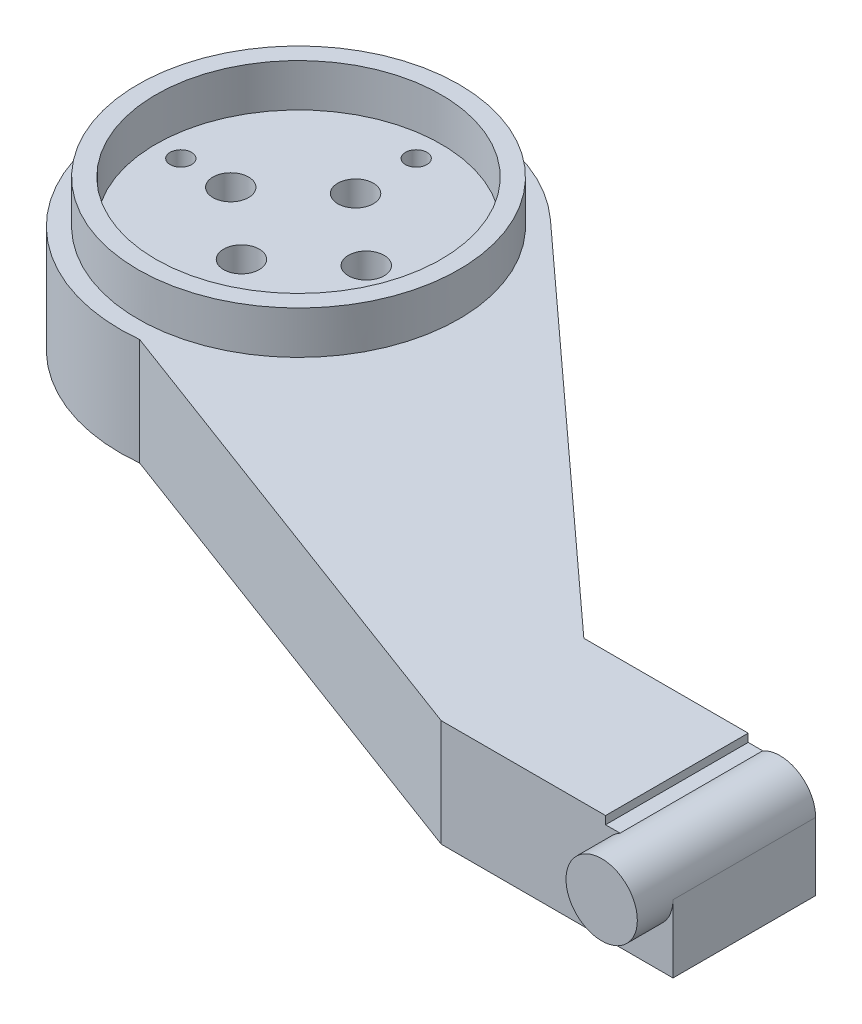
ISO-10303-21;
HEADER;
FILE_DESCRIPTION(('STEP AP214'),'2;1');
FILE_NAME('part.step','',(''),(''),'','','');
FILE_SCHEMA(('AUTOMOTIVE_DESIGN { 1 0 10303 214 1 1 1 1 }'));
ENDSEC;
DATA;
#1=APPLICATION_CONTEXT('core data for automotive mechanical design processes');
#2=APPLICATION_PROTOCOL_DEFINITION('international standard','automotive_design',2000,#1);
#3=PRODUCT_CONTEXT('',#1,'mechanical');
#4=PRODUCT('Part','Part','',(#3));
#5=PRODUCT_RELATED_PRODUCT_CATEGORY('part','',(#4));
#6=PRODUCT_DEFINITION_FORMATION('','',#4);
#7=PRODUCT_DEFINITION_CONTEXT('part definition',#1,'design');
#8=PRODUCT_DEFINITION('design','',#6,#7);
#9=PRODUCT_DEFINITION_SHAPE('','',#8);
#10=(LENGTH_UNIT() NAMED_UNIT(*) SI_UNIT(.MILLI.,.METRE.));
#11=(NAMED_UNIT(*) PLANE_ANGLE_UNIT() SI_UNIT($,.RADIAN.));
#12=(NAMED_UNIT(*) SI_UNIT($,.STERADIAN.) SOLID_ANGLE_UNIT());
#13=UNCERTAINTY_MEASURE_WITH_UNIT(LENGTH_MEASURE(1.E-05),#10,'distance_accuracy_value','');
#14=(GEOMETRIC_REPRESENTATION_CONTEXT(3) GLOBAL_UNCERTAINTY_ASSIGNED_CONTEXT((#13)) GLOBAL_UNIT_ASSIGNED_CONTEXT((#10,
#11,#12)) REPRESENTATION_CONTEXT('',''));
#15=CARTESIAN_POINT('',(0.,0.,0.));
#16=DIRECTION('',(0.,0.,1.));
#17=DIRECTION('',(1.,0.,0.));
#18=AXIS2_PLACEMENT_3D('',#15,#16,#17);
#19=CARTESIAN_POINT('',(-17.5,-5.,10.));
#20=DIRECTION('',(0.,0.,1.));
#21=DIRECTION('',(1.,0.,0.));
#22=AXIS2_PLACEMENT_3D('',#19,#20,#21);
#23=PLANE('',#22);
#24=DIRECTION('',(1.,0.,0.));
#25=VECTOR('',#24,1.);
#26=CARTESIAN_POINT('',(-17.5,8.87626069965704,10.));
#27=LINE('',#26,#25);
#28=CARTESIAN_POINT('',(5.54652098970478,8.87626069965704,10.));
#29=VERTEX_POINT('',#28);
#30=CARTESIAN_POINT('',(7.581665389439,8.87626069965704,10.));
#31=VERTEX_POINT('',#30);
#32=EDGE_CURVE('E178',#29,#31,#27,.T.);
#33=ORIENTED_EDGE('',*,*,#32,.F.);
#34=DIRECTION('',(0.,-1.,0.));
#35=VECTOR('',#34,1.);
#36=CARTESIAN_POINT('',(5.54652098970479,-4.99999999999999,10.));
#37=LINE('',#36,#35);
#38=CARTESIAN_POINT('',(5.54652098970478,10.,10.));
#39=VERTEX_POINT('',#38);
#40=EDGE_CURVE('E180',#39,#29,#37,.T.);
#41=ORIENTED_EDGE('',*,*,#40,.F.);
#42=DIRECTION('',(1.,0.,0.));
#43=VECTOR('',#42,1.);
#44=CARTESIAN_POINT('',(-17.5,10.,10.));
#45=LINE('',#44,#43);
#46=CARTESIAN_POINT('',(-17.5,10.,10.));
#47=VERTEX_POINT('',#46);
#48=EDGE_CURVE('E193',#47,#39,#45,.T.);
#49=ORIENTED_EDGE('',*,*,#48,.F.);
#50=DIRECTION('',(0.,1.,0.));
#51=VECTOR('',#50,1.);
#52=CARTESIAN_POINT('',(-17.5,-5.,10.));
#53=LINE('',#52,#51);
#54=CARTESIAN_POINT('',(-17.5,-5.,10.));
#55=VERTEX_POINT('',#54);
#56=EDGE_CURVE('E200',#55,#47,#53,.T.);
#57=ORIENTED_EDGE('',*,*,#56,.F.);
#58=DIRECTION('',(1.,0.,0.));
#59=VECTOR('',#58,1.);
#60=CARTESIAN_POINT('',(-17.5,-5.,10.));
#61=LINE('',#60,#59);
#62=CARTESIAN_POINT('',(15.,-5.,10.));
#63=VERTEX_POINT('',#62);
#64=EDGE_CURVE('E196',#55,#63,#61,.T.);
#65=ORIENTED_EDGE('',*,*,#64,.T.);
#66=DIRECTION('',(0.,-1.,0.));
#67=VECTOR('',#66,1.);
#68=CARTESIAN_POINT('',(15.,-4.99999999999999,10.));
#69=LINE('',#68,#67);
#70=CARTESIAN_POINT('',(15.,4.5,10.));
#71=VERTEX_POINT('',#70);
#72=EDGE_CURVE('E169',#71,#63,#69,.T.);
#73=ORIENTED_EDGE('',*,*,#72,.F.);
#74=CARTESIAN_POINT('',(10.,4.5,10.));
#75=DIRECTION('',(0.,0.,1.));
#76=DIRECTION('',(1.,0.,0.));
#77=AXIS2_PLACEMENT_3D('',#74,#75,#76);
#78=CIRCLE('',#77,5.);
#79=EDGE_CURVE('E189',#31,#71,#78,.T.);
#80=ORIENTED_EDGE('',*,*,#79,.F.);
#81=EDGE_LOOP('',(#33,#41,#49,#57,#65,#73,#80));
#82=FACE_BOUND('',#81,.T.);
#83=ADVANCED_FACE('F47',(#82),#23,.T.);
#84=CARTESIAN_POINT('',(-17.5,-5.,-10.));
#85=DIRECTION('',(0.,0.,-1.));
#86=DIRECTION('',(-1.,0.,0.));
#87=AXIS2_PLACEMENT_3D('',#84,#85,#86);
#88=PLANE('',#87);
#89=DIRECTION('',(0.,-1.,0.));
#90=VECTOR('',#89,1.);
#91=CARTESIAN_POINT('',(5.54652098970478,8.87626069965704,-10.));
#92=LINE('',#91,#90);
#93=CARTESIAN_POINT('',(5.54652098970478,10.,-10.));
#94=VERTEX_POINT('',#93);
#95=CARTESIAN_POINT('',(5.54652098970478,8.87626069965704,-10.));
#96=VERTEX_POINT('',#95);
#97=EDGE_CURVE('E62',#94,#96,#92,.T.);
#98=ORIENTED_EDGE('',*,*,#97,.T.);
#99=DIRECTION('',(1.,0.,0.));
#100=VECTOR('',#99,1.);
#101=CARTESIAN_POINT('',(7.581665389439,8.87626069965704,-10.));
#102=LINE('',#101,#100);
#103=CARTESIAN_POINT('',(7.581665389439,8.87626069965704,-10.));
#104=VERTEX_POINT('',#103);
#105=EDGE_CURVE('E162',#96,#104,#102,.T.);
#106=ORIENTED_EDGE('',*,*,#105,.T.);
#107=CARTESIAN_POINT('',(10.,4.5,-10.));
#108=DIRECTION('',(0.,0.,-1.));
#109=DIRECTION('',(1.,0.,0.));
#110=AXIS2_PLACEMENT_3D('',#107,#108,#109);
#111=CIRCLE('',#110,5.);
#112=CARTESIAN_POINT('',(15.,4.5,-10.));
#113=VERTEX_POINT('',#112);
#114=EDGE_CURVE('E139',#104,#113,#111,.T.);
#115=ORIENTED_EDGE('',*,*,#114,.T.);
#116=DIRECTION('',(0.,-1.,0.));
#117=VECTOR('',#116,1.);
#118=CARTESIAN_POINT('',(15.,4.5,-10.));
#119=LINE('',#118,#117);
#120=CARTESIAN_POINT('',(15.,-5.,-10.));
#121=VERTEX_POINT('',#120);
#122=EDGE_CURVE('E159',#113,#121,#119,.T.);
#123=ORIENTED_EDGE('',*,*,#122,.T.);
#124=DIRECTION('',(-1.,0.,0.));
#125=VECTOR('',#124,1.);
#126=CARTESIAN_POINT('',(-17.5,-5.,-10.));
#127=LINE('',#126,#125);
#128=CARTESIAN_POINT('',(-17.5,-5.,-10.));
#129=VERTEX_POINT('',#128);
#130=EDGE_CURVE('E70',#121,#129,#127,.T.);
#131=ORIENTED_EDGE('',*,*,#130,.T.);
#132=DIRECTION('',(0.,1.,0.));
#133=VECTOR('',#132,1.);
#134=CARTESIAN_POINT('',(-17.5,-5.,-10.));
#135=LINE('',#134,#133);
#136=CARTESIAN_POINT('',(-17.5,10.,-10.));
#137=VERTEX_POINT('',#136);
#138=EDGE_CURVE('E199',#129,#137,#135,.T.);
#139=ORIENTED_EDGE('',*,*,#138,.T.);
#140=DIRECTION('',(-1.,0.,0.));
#141=VECTOR('',#140,1.);
#142=CARTESIAN_POINT('',(-17.5,10.,-10.));
#143=LINE('',#142,#141);
#144=EDGE_CURVE('E128',#94,#137,#143,.T.);
#145=ORIENTED_EDGE('',*,*,#144,.F.);
#146=EDGE_LOOP('',(#98,#106,#115,#123,#131,#139,#145));
#147=FACE_BOUND('',#146,.T.);
#148=CARTESIAN_POINT('',(10.,4.5,-10.));
#149=DIRECTION('',(0.,0.,-1.));
#150=DIRECTION('',(-1.,0.,0.));
#151=AXIS2_PLACEMENT_3D('',#148,#149,#150);
#152=CIRCLE('',#151,3.);
#153=CARTESIAN_POINT('',(7.,4.5,-10.));
#154=VERTEX_POINT('',#153);
#155=EDGE_CURVE('E185',#154,#154,#152,.T.);
#156=ORIENTED_EDGE('',*,*,#155,.F.);
#157=EDGE_LOOP('',(#156));
#158=FACE_BOUND('',#157,.T.);
#159=ADVANCED_FACE('F49',(#147,#158),#88,.T.);
#160=CARTESIAN_POINT('',(0.,-5.,0.));
#161=DIRECTION('',(0.,-1.,0.));
#162=DIRECTION('',(0.,0.,-1.));
#163=AXIS2_PLACEMENT_3D('',#160,#161,#162);
#164=PLANE('',#163);
#165=DIRECTION('',(0.,0.,1.));
#166=VECTOR('',#165,1.);
#167=CARTESIAN_POINT('',(15.,-5.,-10.));
#168=LINE('',#167,#166);
#169=EDGE_CURVE('E173',#121,#63,#168,.T.);
#170=ORIENTED_EDGE('',*,*,#169,.T.);
#171=ORIENTED_EDGE('',*,*,#64,.F.);
#172=DIRECTION('',(0.936972327871843,0.,0.349403572967448));
#173=VECTOR('',#172,1.);
#174=CARTESIAN_POINT('',(-84.9034213971923,-5.,-15.1352100439308));
#175=LINE('',#174,#173);
#176=CARTESIAN_POINT('',(-84.9034213971923,-5.,-15.1352100439308));
#177=VERTEX_POINT('',#176);
#178=EDGE_CURVE('E131',#177,#55,#175,.T.);
#179=ORIENTED_EDGE('',*,*,#178,.F.);
#180=CARTESIAN_POINT('',(-87.5,-5.,-40.));
#181=DIRECTION('',(0.,1.,0.));
#182=DIRECTION('',(0.,0.,1.));
#183=AXIS2_PLACEMENT_3D('',#180,#181,#182);
#184=CIRCLE('',#183,25.);
#185=CARTESIAN_POINT('',(-70.6546371315055,-5.,-58.4725133598205));
#186=VERTEX_POINT('',#185);
#187=EDGE_CURVE('E151',#186,#177,#184,.T.);
#188=ORIENTED_EDGE('',*,*,#187,.F.);
#189=DIRECTION('',(-0.73890053439282,0.,-0.67381451473978));
#190=VECTOR('',#189,1.);
#191=CARTESIAN_POINT('',(-17.5,-5.,-10.));
#192=LINE('',#191,#190);
#193=EDGE_CURVE('E136',#129,#186,#192,.T.);
#194=ORIENTED_EDGE('',*,*,#193,.F.);
#195=ORIENTED_EDGE('',*,*,#130,.F.);
#196=EDGE_LOOP('',(#170,#171,#179,#188,#194,#195));
#197=FACE_BOUND('',#196,.T.);
#198=ADVANCED_FACE('F221',(#197),#164,.T.);
#199=CARTESIAN_POINT('',(0.,10.,0.));
#200=DIRECTION('',(0.,-1.,0.));
#201=DIRECTION('',(0.,0.,-1.));
#202=AXIS2_PLACEMENT_3D('',#199,#200,#201);
#203=PLANE('',#202);
#204=CARTESIAN_POINT('',(-87.5,10.,-40.));
#205=DIRECTION('',(0.,-1.,0.));
#206=DIRECTION('',(0.,0.,-1.));
#207=AXIS2_PLACEMENT_3D('',#204,#205,#206);
#208=CIRCLE('',#207,22.5);
#209=CARTESIAN_POINT('',(-87.5,10.,-62.5));
#210=VERTEX_POINT('',#209);
#211=EDGE_CURVE('E11',#210,#210,#208,.F.);
#212=ORIENTED_EDGE('',*,*,#211,.F.);
#213=EDGE_LOOP('',(#212));
#214=FACE_BOUND('',#213,.T.);
#215=ORIENTED_EDGE('',*,*,#48,.T.);
#216=DIRECTION('',(0.,0.,-1.));
#217=VECTOR('',#216,1.);
#218=CARTESIAN_POINT('',(5.54652098970478,10.,0.));
#219=LINE('',#218,#217);
#220=EDGE_CURVE('E55',#39,#94,#219,.T.);
#221=ORIENTED_EDGE('',*,*,#220,.T.);
#222=ORIENTED_EDGE('',*,*,#144,.T.);
#223=DIRECTION('',(-0.73890053439282,0.,-0.67381451473978));
#224=VECTOR('',#223,1.);
#225=CARTESIAN_POINT('',(-17.5,10.,-10.));
#226=LINE('',#225,#224);
#227=CARTESIAN_POINT('',(-70.6546371315055,10.,-58.4725133598205));
#228=VERTEX_POINT('',#227);
#229=EDGE_CURVE('E119',#137,#228,#226,.T.);
#230=ORIENTED_EDGE('',*,*,#229,.T.);
#231=CARTESIAN_POINT('',(-87.5,10.,-40.));
#232=DIRECTION('',(0.,1.,0.));
#233=DIRECTION('',(0.,0.,1.));
#234=AXIS2_PLACEMENT_3D('',#231,#232,#233);
#235=CIRCLE('',#234,25.);
#236=CARTESIAN_POINT('',(-84.9034213971923,10.,-15.1352100439308));
#237=VERTEX_POINT('',#236);
#238=EDGE_CURVE('E125',#228,#237,#235,.T.);
#239=ORIENTED_EDGE('',*,*,#238,.T.);
#240=DIRECTION('',(0.936972327871843,0.,0.349403572967448));
#241=VECTOR('',#240,1.);
#242=CARTESIAN_POINT('',(-84.9034213971923,10.,-15.1352100439308));
#243=LINE('',#242,#241);
#244=EDGE_CURVE('E145',#237,#47,#243,.T.);
#245=ORIENTED_EDGE('',*,*,#244,.T.);
#246=EDGE_LOOP('',(#215,#221,#222,#230,#239,#245));
#247=FACE_BOUND('',#246,.T.);
#248=ADVANCED_FACE('F122',(#214,#247),#203,.F.);
#249=CARTESIAN_POINT('',(10.,4.5,15.));
#250=DIRECTION('',(0.,0.,-1.));
#251=DIRECTION('',(-1.,0.,0.));
#252=AXIS2_PLACEMENT_3D('',#249,#250,#251);
#253=CYLINDRICAL_SURFACE('',#252,5.);
#254=ORIENTED_EDGE('',*,*,#79,.T.);
#255=DIRECTION('',(0.,0.,1.));
#256=VECTOR('',#255,1.);
#257=CARTESIAN_POINT('',(15.,4.5,-10.));
#258=LINE('',#257,#256);
#259=EDGE_CURVE('E165',#113,#71,#258,.T.);
#260=ORIENTED_EDGE('',*,*,#259,.F.);
#261=ORIENTED_EDGE('',*,*,#114,.F.);
#262=DIRECTION('',(0.,0.,1.));
#263=VECTOR('',#262,1.);
#264=CARTESIAN_POINT('',(7.581665389439,8.87626069965704,-10.));
#265=LINE('',#264,#263);
#266=EDGE_CURVE('E166',#104,#31,#265,.T.);
#267=ORIENTED_EDGE('',*,*,#266,.T.);
#268=EDGE_LOOP('',(#254,#260,#261,#267));
#269=FACE_BOUND('',#268,.T.);
#270=CARTESIAN_POINT('',(10.,4.5,15.));
#271=DIRECTION('',(0.,0.,1.));
#272=DIRECTION('',(1.,0.,0.));
#273=AXIS2_PLACEMENT_3D('',#270,#271,#272);
#274=CIRCLE('',#273,5.);
#275=CARTESIAN_POINT('',(15.,4.5,15.));
#276=VERTEX_POINT('',#275);
#277=EDGE_CURVE('E186',#276,#276,#274,.T.);
#278=ORIENTED_EDGE('',*,*,#277,.F.);
#279=EDGE_LOOP('',(#278));
#280=FACE_BOUND('',#279,.T.);
#281=ADVANCED_FACE('F214',(#269,#280),#253,.T.);
#282=CARTESIAN_POINT('',(10.,4.5,15.));
#283=DIRECTION('',(0.,0.,1.));
#284=DIRECTION('',(1.,0.,0.));
#285=AXIS2_PLACEMENT_3D('',#282,#283,#284);
#286=PLANE('',#285);
#287=ORIENTED_EDGE('',*,*,#277,.T.);
#288=EDGE_LOOP('',(#287));
#289=FACE_BOUND('',#288,.T.);
#290=ADVANCED_FACE('F251',(#289),#286,.T.);
#291=CARTESIAN_POINT('',(10.,4.5,-15.));
#292=DIRECTION('',(0.,0.,1.));
#293=DIRECTION('',(1.,0.,0.));
#294=AXIS2_PLACEMENT_3D('',#291,#292,#293);
#295=CYLINDRICAL_SURFACE('',#294,3.);
#296=ORIENTED_EDGE('',*,*,#155,.T.);
#297=EDGE_LOOP('',(#296));
#298=FACE_BOUND('',#297,.T.);
#299=CARTESIAN_POINT('',(10.,4.5,-5.));
#300=DIRECTION('',(0.,0.,1.));
#301=DIRECTION('',(1.,0.,0.));
#302=AXIS2_PLACEMENT_3D('',#299,#300,#301);
#303=CIRCLE('',#302,3.);
#304=CARTESIAN_POINT('',(13.,4.5,-5.));
#305=VERTEX_POINT('',#304);
#306=EDGE_CURVE('E182',#305,#305,#303,.T.);
#307=ORIENTED_EDGE('',*,*,#306,.T.);
#308=EDGE_LOOP('',(#307));
#309=FACE_BOUND('',#308,.T.);
#310=ADVANCED_FACE('F254',(#298,#309),#295,.F.);
#311=CARTESIAN_POINT('',(10.,4.5,-5.));
#312=DIRECTION('',(0.,0.,1.));
#313=DIRECTION('',(1.,0.,0.));
#314=AXIS2_PLACEMENT_3D('',#311,#312,#313);
#315=PLANE('',#314);
#316=ORIENTED_EDGE('',*,*,#306,.F.);
#317=EDGE_LOOP('',(#316));
#318=FACE_BOUND('',#317,.T.);
#319=ADVANCED_FACE('F236',(#318),#315,.F.);
#320=CARTESIAN_POINT('',(7.581665389439,8.87626069965704,-10.));
#321=DIRECTION('',(0.,-1.,0.));
#322=DIRECTION('',(0.,0.,-1.));
#323=AXIS2_PLACEMENT_3D('',#320,#321,#322);
#324=PLANE('',#323);
#325=ORIENTED_EDGE('',*,*,#32,.T.);
#326=ORIENTED_EDGE('',*,*,#266,.F.);
#327=ORIENTED_EDGE('',*,*,#105,.F.);
#328=DIRECTION('',(0.,0.,1.));
#329=VECTOR('',#328,1.);
#330=CARTESIAN_POINT('',(5.54652098970478,8.87626069965704,-10.));
#331=LINE('',#330,#329);
#332=EDGE_CURVE('E170',#96,#29,#331,.T.);
#333=ORIENTED_EDGE('',*,*,#332,.T.);
#334=EDGE_LOOP('',(#325,#326,#327,#333));
#335=FACE_BOUND('',#334,.T.);
#336=ADVANCED_FACE('F210',(#335),#324,.F.);
#337=CARTESIAN_POINT('',(5.54652098970478,8.87626069965704,-10.));
#338=DIRECTION('',(-1.,0.,0.));
#339=DIRECTION('',(0.,-1.,0.));
#340=AXIS2_PLACEMENT_3D('',#337,#338,#339);
#341=PLANE('',#340);
#342=ORIENTED_EDGE('',*,*,#40,.T.);
#343=ORIENTED_EDGE('',*,*,#332,.F.);
#344=ORIENTED_EDGE('',*,*,#97,.F.);
#345=ORIENTED_EDGE('',*,*,#220,.F.);
#346=EDGE_LOOP('',(#342,#343,#344,#345));
#347=FACE_BOUND('',#346,.T.);
#348=ADVANCED_FACE('F227',(#347),#341,.F.);
#349=CARTESIAN_POINT('',(15.,4.5,-10.));
#350=DIRECTION('',(-1.,0.,0.));
#351=DIRECTION('',(0.,-1.,0.));
#352=AXIS2_PLACEMENT_3D('',#349,#350,#351);
#353=PLANE('',#352);
#354=ORIENTED_EDGE('',*,*,#72,.T.);
#355=ORIENTED_EDGE('',*,*,#169,.F.);
#356=ORIENTED_EDGE('',*,*,#122,.F.);
#357=ORIENTED_EDGE('',*,*,#259,.T.);
#358=EDGE_LOOP('',(#354,#355,#356,#357));
#359=FACE_BOUND('',#358,.T.);
#360=ADVANCED_FACE('F219',(#359),#353,.F.);
#361=CARTESIAN_POINT('',(-17.5,10.,-10.));
#362=DIRECTION('',(-0.67381451473978,0.,0.73890053439282));
#363=DIRECTION('',(0.73890053439282,0.,0.67381451473978));
#364=AXIS2_PLACEMENT_3D('',#361,#362,#363);
#365=PLANE('',#364);
#366=ORIENTED_EDGE('',*,*,#193,.T.);
#367=DIRECTION('',(0.,-1.,0.));
#368=VECTOR('',#367,1.);
#369=CARTESIAN_POINT('',(-70.6546371315055,10.,-58.4725133598205));
#370=LINE('',#369,#368);
#371=EDGE_CURVE('E134',#228,#186,#370,.T.);
#372=ORIENTED_EDGE('',*,*,#371,.F.);
#373=ORIENTED_EDGE('',*,*,#229,.F.);
#374=ORIENTED_EDGE('',*,*,#138,.F.);
#375=EDGE_LOOP('',(#366,#372,#373,#374));
#376=FACE_BOUND('',#375,.T.);
#377=ADVANCED_FACE('F135',(#376),#365,.F.);
#378=CARTESIAN_POINT('',(-87.5,10.,-40.));
#379=DIRECTION('',(0.,-1.,0.));
#380=DIRECTION('',(0.,0.,-1.));
#381=AXIS2_PLACEMENT_3D('',#378,#379,#380);
#382=CYLINDRICAL_SURFACE('',#381,25.);
#383=ORIENTED_EDGE('',*,*,#187,.T.);
#384=DIRECTION('',(0.,-1.,0.));
#385=VECTOR('',#384,1.);
#386=CARTESIAN_POINT('',(-84.9034213971923,10.,-15.1352100439308));
#387=LINE('',#386,#385);
#388=EDGE_CURVE('E140',#237,#177,#387,.T.);
#389=ORIENTED_EDGE('',*,*,#388,.F.);
#390=ORIENTED_EDGE('',*,*,#238,.F.);
#391=ORIENTED_EDGE('',*,*,#371,.T.);
#392=EDGE_LOOP('',(#383,#389,#390,#391));
#393=FACE_BOUND('',#392,.T.);
#394=ADVANCED_FACE('F142',(#393),#382,.T.);
#395=CARTESIAN_POINT('',(-84.9034213971923,10.,-15.1352100439308));
#396=DIRECTION('',(0.349403572967448,0.,-0.936972327871843));
#397=DIRECTION('',(-0.936972327871843,0.,-0.349403572967448));
#398=AXIS2_PLACEMENT_3D('',#395,#396,#397);
#399=PLANE('',#398);
#400=ORIENTED_EDGE('',*,*,#178,.T.);
#401=ORIENTED_EDGE('',*,*,#56,.T.);
#402=ORIENTED_EDGE('',*,*,#244,.F.);
#403=ORIENTED_EDGE('',*,*,#388,.T.);
#404=EDGE_LOOP('',(#400,#401,#402,#403));
#405=FACE_BOUND('',#404,.T.);
#406=ADVANCED_FACE('F224',(#405),#399,.F.);
#407=CARTESIAN_POINT('',(-87.5,16.,-40.));
#408=DIRECTION('',(0.,1.,0.));
#409=DIRECTION('',(0.,0.,1.));
#410=AXIS2_PLACEMENT_3D('',#407,#408,#409);
#411=PLANE('',#410);
#412=CARTESIAN_POINT('',(-87.5,16.,-40.));
#413=DIRECTION('',(0.,1.,0.));
#414=DIRECTION('',(0.,0.,1.));
#415=AXIS2_PLACEMENT_3D('',#412,#413,#414);
#416=CIRCLE('',#415,22.5);
#417=CARTESIAN_POINT('',(-87.5,16.,-17.5));
#418=VERTEX_POINT('',#417);
#419=EDGE_CURVE('E152',#418,#418,#416,.T.);
#420=ORIENTED_EDGE('',*,*,#419,.T.);
#421=EDGE_LOOP('',(#420));
#422=FACE_BOUND('',#421,.T.);
#423=CARTESIAN_POINT('',(-87.5,16.,-40.));
#424=DIRECTION('',(0.,1.,0.));
#425=DIRECTION('',(0.,0.,1.));
#426=AXIS2_PLACEMENT_3D('',#423,#424,#425);
#427=CIRCLE('',#426,20.);
#428=CARTESIAN_POINT('',(-87.5,16.,-20.));
#429=VERTEX_POINT('',#428);
#430=EDGE_CURVE('E649',#429,#429,#427,.T.);
#431=ORIENTED_EDGE('',*,*,#430,.F.);
#432=EDGE_LOOP('',(#431));
#433=FACE_BOUND('',#432,.T.);
#434=ADVANCED_FACE('F369',(#422,#433),#411,.T.);
#435=CARTESIAN_POINT('',(-87.5,16.,-40.));
#436=DIRECTION('',(0.,-1.,0.));
#437=DIRECTION('',(0.,0.,-1.));
#438=AXIS2_PLACEMENT_3D('',#435,#436,#437);
#439=CYLINDRICAL_SURFACE('',#438,22.5);
#440=ORIENTED_EDGE('',*,*,#419,.F.);
#441=EDGE_LOOP('',(#440));
#442=FACE_BOUND('',#441,.T.);
#443=ORIENTED_EDGE('',*,*,#211,.T.);
#444=EDGE_LOOP('',(#443));
#445=FACE_BOUND('',#444,.T.);
#446=ADVANCED_FACE('F391',(#442,#445),#439,.T.);
#447=CARTESIAN_POINT('',(-87.5,16.,-40.));
#448=DIRECTION('',(0.,-1.,0.));
#449=DIRECTION('',(0.,0.,-1.));
#450=AXIS2_PLACEMENT_3D('',#447,#448,#449);
#451=CYLINDRICAL_SURFACE('',#450,20.);
#452=ORIENTED_EDGE('',*,*,#430,.T.);
#453=EDGE_LOOP('',(#452));
#454=FACE_BOUND('',#453,.T.);
#455=CARTESIAN_POINT('',(-87.5,10.,-40.));
#456=DIRECTION('',(0.,1.,0.));
#457=DIRECTION('',(0.,0.,1.));
#458=AXIS2_PLACEMENT_3D('',#455,#456,#457);
#459=CIRCLE('',#458,20.);
#460=CARTESIAN_POINT('',(-87.5,10.,-20.));
#461=VERTEX_POINT('',#460);
#462=EDGE_CURVE('E646',#461,#461,#459,.T.);
#463=ORIENTED_EDGE('',*,*,#462,.F.);
#464=EDGE_LOOP('',(#463));
#465=FACE_BOUND('',#464,.T.);
#466=ADVANCED_FACE('F379',(#454,#465),#451,.F.);
#467=CARTESIAN_POINT('',(-87.5,10.,-32.));
#468=DIRECTION('',(0.,1.,0.));
#469=DIRECTION('',(0.,0.,-1.));
#470=AXIS2_PLACEMENT_3D('',#467,#468,#469);
#471=CIRCLE('',#470,2.5);
#472=CARTESIAN_POINT('',(-87.5,10.,-34.5));
#473=VERTEX_POINT('',#472);
#474=EDGE_CURVE('E618',#473,#473,#471,.T.);
#475=ORIENTED_EDGE('',*,*,#474,.F.);
#476=EDGE_LOOP('',(#475));
#477=FACE_BOUND('',#476,.T.);
#478=CARTESIAN_POINT('',(-104.,10.,-40.));
#479=DIRECTION('',(0.,1.,0.));
#480=DIRECTION('',(0.,0.,1.));
#481=AXIS2_PLACEMENT_3D('',#478,#479,#480);
#482=CIRCLE('',#481,1.5);
#483=CARTESIAN_POINT('',(-104.,10.,-38.5));
#484=VERTEX_POINT('',#483);
#485=EDGE_CURVE('E642',#484,#484,#482,.T.);
#486=ORIENTED_EDGE('',*,*,#485,.F.);
#487=EDGE_LOOP('',(#486));
#488=FACE_BOUND('',#487,.T.);
#489=CARTESIAN_POINT('',(-97.,10.,-40.));
#490=DIRECTION('',(0.,1.,0.));
#491=DIRECTION('',(0.,0.,1.));
#492=AXIS2_PLACEMENT_3D('',#489,#490,#491);
#493=CIRCLE('',#492,2.5);
#494=CARTESIAN_POINT('',(-97.,10.,-37.5));
#495=VERTEX_POINT('',#494);
#496=EDGE_CURVE('E636',#495,#495,#493,.T.);
#497=ORIENTED_EDGE('',*,*,#496,.F.);
#498=EDGE_LOOP('',(#497));
#499=FACE_BOUND('',#498,.T.);
#500=CARTESIAN_POINT('',(-87.5,10.,-56.5));
#501=DIRECTION('',(0.,1.,0.));
#502=DIRECTION('',(0.,0.,1.));
#503=AXIS2_PLACEMENT_3D('',#500,#501,#502);
#504=CIRCLE('',#503,1.5);
#505=CARTESIAN_POINT('',(-87.5,10.,-55.));
#506=VERTEX_POINT('',#505);
#507=EDGE_CURVE('E629',#506,#506,#504,.T.);
#508=ORIENTED_EDGE('',*,*,#507,.F.);
#509=EDGE_LOOP('',(#508));
#510=FACE_BOUND('',#509,.T.);
#511=CARTESIAN_POINT('',(-78.,10.,-40.));
#512=DIRECTION('',(0.,1.,0.));
#513=DIRECTION('',(0.,0.,-1.));
#514=AXIS2_PLACEMENT_3D('',#511,#512,#513);
#515=CIRCLE('',#514,2.5);
#516=CARTESIAN_POINT('',(-78.,10.,-42.5));
#517=VERTEX_POINT('',#516);
#518=EDGE_CURVE('E677',#517,#517,#515,.T.);
#519=ORIENTED_EDGE('',*,*,#518,.F.);
#520=EDGE_LOOP('',(#519));
#521=FACE_BOUND('',#520,.T.);
#522=CARTESIAN_POINT('',(-71.,10.,-40.));
#523=DIRECTION('',(0.,1.,0.));
#524=DIRECTION('',(0.,0.,-1.));
#525=AXIS2_PLACEMENT_3D('',#522,#523,#524);
#526=CIRCLE('',#525,1.5);
#527=CARTESIAN_POINT('',(-71.,10.,-41.5));
#528=VERTEX_POINT('',#527);
#529=EDGE_CURVE('E676',#528,#528,#526,.T.);
#530=ORIENTED_EDGE('',*,*,#529,.F.);
#531=EDGE_LOOP('',(#530));
#532=FACE_BOUND('',#531,.T.);
#533=CARTESIAN_POINT('',(-87.5,10.,-23.5));
#534=DIRECTION('',(0.,1.,0.));
#535=DIRECTION('',(0.,0.,-1.));
#536=AXIS2_PLACEMENT_3D('',#533,#534,#535);
#537=CIRCLE('',#536,1.5);
#538=CARTESIAN_POINT('',(-87.5,10.,-25.));
#539=VERTEX_POINT('',#538);
#540=EDGE_CURVE('E619',#539,#539,#537,.T.);
#541=ORIENTED_EDGE('',*,*,#540,.F.);
#542=EDGE_LOOP('',(#541));
#543=FACE_BOUND('',#542,.T.);
#544=CARTESIAN_POINT('',(-87.5,10.,-48.));
#545=DIRECTION('',(0.,1.,0.));
#546=DIRECTION('',(0.,0.,1.));
#547=AXIS2_PLACEMENT_3D('',#544,#545,#546);
#548=CIRCLE('',#547,2.5);
#549=CARTESIAN_POINT('',(-87.5,10.,-45.5));
#550=VERTEX_POINT('',#549);
#551=EDGE_CURVE('E632',#550,#550,#548,.T.);
#552=ORIENTED_EDGE('',*,*,#551,.F.);
#553=EDGE_LOOP('',(#552));
#554=FACE_BOUND('',#553,.T.);
#555=ORIENTED_EDGE('',*,*,#462,.T.);
#556=EDGE_LOOP('',(#555));
#557=FACE_BOUND('',#556,.T.);
#558=ADVANCED_FACE('F248',(#477,#488,#499,#510,#521,#532,#543,#554,#557),#203,.F.);
#559=CARTESIAN_POINT('',(-87.5,4.,-48.));
#560=DIRECTION('',(0.,1.,0.));
#561=DIRECTION('',(0.,0.,1.));
#562=AXIS2_PLACEMENT_3D('',#559,#560,#561);
#563=CYLINDRICAL_SURFACE('',#562,2.5);
#564=CARTESIAN_POINT('',(-87.5,4.,-48.));
#565=DIRECTION('',(0.,1.,0.));
#566=DIRECTION('',(0.,0.,1.));
#567=AXIS2_PLACEMENT_3D('',#564,#565,#566);
#568=CIRCLE('',#567,2.5);
#569=CARTESIAN_POINT('',(-87.5,4.,-45.5));
#570=VERTEX_POINT('',#569);
#571=EDGE_CURVE('E643',#570,#570,#568,.T.);
#572=ORIENTED_EDGE('',*,*,#571,.F.);
#573=EDGE_LOOP('',(#572));
#574=FACE_BOUND('',#573,.T.);
#575=ORIENTED_EDGE('',*,*,#551,.T.);
#576=EDGE_LOOP('',(#575));
#577=FACE_BOUND('',#576,.T.);
#578=ADVANCED_FACE('F378',(#574,#577),#563,.F.);
#579=CARTESIAN_POINT('',(-87.5,4.,-48.));
#580=DIRECTION('',(0.,1.,0.));
#581=DIRECTION('',(0.,0.,1.));
#582=AXIS2_PLACEMENT_3D('',#579,#580,#581);
#583=PLANE('',#582);
#584=ORIENTED_EDGE('',*,*,#571,.T.);
#585=EDGE_LOOP('',(#584));
#586=FACE_BOUND('',#585,.T.);
#587=ADVANCED_FACE('F422',(#586),#583,.T.);
#588=CARTESIAN_POINT('',(-87.5,4.,-23.5));
#589=DIRECTION('',(0.,1.,0.));
#590=DIRECTION('',(0.,0.,1.));
#591=AXIS2_PLACEMENT_3D('',#588,#589,#590);
#592=CYLINDRICAL_SURFACE('',#591,1.5);
#593=CARTESIAN_POINT('',(-87.5,4.,-23.5));
#594=DIRECTION('',(0.,1.,0.));
#595=DIRECTION('',(0.,0.,-1.));
#596=AXIS2_PLACEMENT_3D('',#593,#594,#595);
#597=CIRCLE('',#596,1.5);
#598=CARTESIAN_POINT('',(-87.5,4.,-25.));
#599=VERTEX_POINT('',#598);
#600=EDGE_CURVE('E625',#599,#599,#597,.T.);
#601=ORIENTED_EDGE('',*,*,#600,.F.);
#602=EDGE_LOOP('',(#601));
#603=FACE_BOUND('',#602,.T.);
#604=ORIENTED_EDGE('',*,*,#540,.T.);
#605=EDGE_LOOP('',(#604));
#606=FACE_BOUND('',#605,.T.);
#607=ADVANCED_FACE('F433',(#603,#606),#592,.F.);
#608=CARTESIAN_POINT('',(-87.5,4.,-23.5));
#609=DIRECTION('',(0.,-1.,0.));
#610=DIRECTION('',(0.,0.,-1.));
#611=AXIS2_PLACEMENT_3D('',#608,#609,#610);
#612=PLANE('',#611);
#613=ORIENTED_EDGE('',*,*,#600,.T.);
#614=EDGE_LOOP('',(#613));
#615=FACE_BOUND('',#614,.T.);
#616=ADVANCED_FACE('F444',(#615),#612,.F.);
#617=CARTESIAN_POINT('',(-71.,4.,-40.));
#618=DIRECTION('',(0.,1.,0.));
#619=DIRECTION('',(0.,0.,1.));
#620=AXIS2_PLACEMENT_3D('',#617,#618,#619);
#621=CYLINDRICAL_SURFACE('',#620,1.5);
#622=CARTESIAN_POINT('',(-71.,4.,-40.));
#623=DIRECTION('',(0.,1.,0.));
#624=DIRECTION('',(0.,0.,-1.));
#625=AXIS2_PLACEMENT_3D('',#622,#623,#624);
#626=CIRCLE('',#625,1.5);
#627=CARTESIAN_POINT('',(-71.,4.,-41.5));
#628=VERTEX_POINT('',#627);
#629=EDGE_CURVE('E673',#628,#628,#626,.T.);
#630=ORIENTED_EDGE('',*,*,#629,.F.);
#631=EDGE_LOOP('',(#630));
#632=FACE_BOUND('',#631,.T.);
#633=ORIENTED_EDGE('',*,*,#529,.T.);
#634=EDGE_LOOP('',(#633));
#635=FACE_BOUND('',#634,.T.);
#636=ADVANCED_FACE('F455',(#632,#635),#621,.F.);
#637=CARTESIAN_POINT('',(-71.,4.,-40.));
#638=DIRECTION('',(0.,-1.,0.));
#639=DIRECTION('',(0.,0.,-1.));
#640=AXIS2_PLACEMENT_3D('',#637,#638,#639);
#641=PLANE('',#640);
#642=ORIENTED_EDGE('',*,*,#629,.T.);
#643=EDGE_LOOP('',(#642));
#644=FACE_BOUND('',#643,.T.);
#645=ADVANCED_FACE('F466',(#644),#641,.F.);
#646=CARTESIAN_POINT('',(-78.,4.,-40.));
#647=DIRECTION('',(0.,1.,0.));
#648=DIRECTION('',(0.,0.,1.));
#649=AXIS2_PLACEMENT_3D('',#646,#647,#648);
#650=CYLINDRICAL_SURFACE('',#649,2.5);
#651=CARTESIAN_POINT('',(-78.,4.,-40.));
#652=DIRECTION('',(0.,1.,0.));
#653=DIRECTION('',(0.,0.,-1.));
#654=AXIS2_PLACEMENT_3D('',#651,#652,#653);
#655=CIRCLE('',#654,2.5);
#656=CARTESIAN_POINT('',(-78.,4.,-42.5));
#657=VERTEX_POINT('',#656);
#658=EDGE_CURVE('E682',#657,#657,#655,.T.);
#659=ORIENTED_EDGE('',*,*,#658,.F.);
#660=EDGE_LOOP('',(#659));
#661=FACE_BOUND('',#660,.T.);
#662=ORIENTED_EDGE('',*,*,#518,.T.);
#663=EDGE_LOOP('',(#662));
#664=FACE_BOUND('',#663,.T.);
#665=ADVANCED_FACE('F477',(#661,#664),#650,.F.);
#666=CARTESIAN_POINT('',(-78.,4.,-40.));
#667=DIRECTION('',(0.,-1.,0.));
#668=DIRECTION('',(0.,0.,-1.));
#669=AXIS2_PLACEMENT_3D('',#666,#667,#668);
#670=PLANE('',#669);
#671=ORIENTED_EDGE('',*,*,#658,.T.);
#672=EDGE_LOOP('',(#671));
#673=FACE_BOUND('',#672,.T.);
#674=ADVANCED_FACE('F488',(#673),#670,.F.);
#675=CARTESIAN_POINT('',(-87.5,4.,-56.5));
#676=DIRECTION('',(0.,1.,0.));
#677=DIRECTION('',(0.,0.,1.));
#678=AXIS2_PLACEMENT_3D('',#675,#676,#677);
#679=CYLINDRICAL_SURFACE('',#678,1.5);
#680=CARTESIAN_POINT('',(-87.5,4.,-56.5));
#681=DIRECTION('',(0.,1.,0.));
#682=DIRECTION('',(0.,0.,1.));
#683=AXIS2_PLACEMENT_3D('',#680,#681,#682);
#684=CIRCLE('',#683,1.5);
#685=CARTESIAN_POINT('',(-87.5,4.,-55.));
#686=VERTEX_POINT('',#685);
#687=EDGE_CURVE('E633',#686,#686,#684,.T.);
#688=ORIENTED_EDGE('',*,*,#687,.F.);
#689=EDGE_LOOP('',(#688));
#690=FACE_BOUND('',#689,.T.);
#691=ORIENTED_EDGE('',*,*,#507,.T.);
#692=EDGE_LOOP('',(#691));
#693=FACE_BOUND('',#692,.T.);
#694=ADVANCED_FACE('F499',(#690,#693),#679,.F.);
#695=CARTESIAN_POINT('',(-87.5,4.,-56.5));
#696=DIRECTION('',(0.,1.,0.));
#697=DIRECTION('',(0.,0.,1.));
#698=AXIS2_PLACEMENT_3D('',#695,#696,#697);
#699=PLANE('',#698);
#700=ORIENTED_EDGE('',*,*,#687,.T.);
#701=EDGE_LOOP('',(#700));
#702=FACE_BOUND('',#701,.T.);
#703=ADVANCED_FACE('F510',(#702),#699,.T.);
#704=CARTESIAN_POINT('',(-97.,4.,-40.));
#705=DIRECTION('',(0.,1.,0.));
#706=DIRECTION('',(0.,0.,1.));
#707=AXIS2_PLACEMENT_3D('',#704,#705,#706);
#708=CYLINDRICAL_SURFACE('',#707,2.5);
#709=CARTESIAN_POINT('',(-97.,4.,-40.));
#710=DIRECTION('',(0.,1.,0.));
#711=DIRECTION('',(0.,0.,1.));
#712=AXIS2_PLACEMENT_3D('',#709,#710,#711);
#713=CIRCLE('',#712,2.5);
#714=CARTESIAN_POINT('',(-97.,4.,-37.5));
#715=VERTEX_POINT('',#714);
#716=EDGE_CURVE('E639',#715,#715,#713,.T.);
#717=ORIENTED_EDGE('',*,*,#716,.F.);
#718=EDGE_LOOP('',(#717));
#719=FACE_BOUND('',#718,.T.);
#720=ORIENTED_EDGE('',*,*,#496,.T.);
#721=EDGE_LOOP('',(#720));
#722=FACE_BOUND('',#721,.T.);
#723=ADVANCED_FACE('F521',(#719,#722),#708,.F.);
#724=CARTESIAN_POINT('',(-97.,4.,-40.));
#725=DIRECTION('',(0.,1.,0.));
#726=DIRECTION('',(0.,0.,1.));
#727=AXIS2_PLACEMENT_3D('',#724,#725,#726);
#728=PLANE('',#727);
#729=ORIENTED_EDGE('',*,*,#716,.T.);
#730=EDGE_LOOP('',(#729));
#731=FACE_BOUND('',#730,.T.);
#732=ADVANCED_FACE('F532',(#731),#728,.T.);
#733=CARTESIAN_POINT('',(-104.,4.,-40.));
#734=DIRECTION('',(0.,1.,0.));
#735=DIRECTION('',(0.,0.,1.));
#736=AXIS2_PLACEMENT_3D('',#733,#734,#735);
#737=CYLINDRICAL_SURFACE('',#736,1.5);
#738=CARTESIAN_POINT('',(-104.,4.,-40.));
#739=DIRECTION('',(0.,1.,0.));
#740=DIRECTION('',(0.,0.,1.));
#741=AXIS2_PLACEMENT_3D('',#738,#739,#740);
#742=CIRCLE('',#741,1.5);
#743=CARTESIAN_POINT('',(-104.,4.,-38.5));
#744=VERTEX_POINT('',#743);
#745=EDGE_CURVE('E622',#744,#744,#742,.T.);
#746=ORIENTED_EDGE('',*,*,#745,.F.);
#747=EDGE_LOOP('',(#746));
#748=FACE_BOUND('',#747,.T.);
#749=ORIENTED_EDGE('',*,*,#485,.T.);
#750=EDGE_LOOP('',(#749));
#751=FACE_BOUND('',#750,.T.);
#752=ADVANCED_FACE('F543',(#748,#751),#737,.F.);
#753=CARTESIAN_POINT('',(-104.,4.,-40.));
#754=DIRECTION('',(0.,1.,0.));
#755=DIRECTION('',(0.,0.,1.));
#756=AXIS2_PLACEMENT_3D('',#753,#754,#755);
#757=PLANE('',#756);
#758=ORIENTED_EDGE('',*,*,#745,.T.);
#759=EDGE_LOOP('',(#758));
#760=FACE_BOUND('',#759,.T.);
#761=ADVANCED_FACE('F554',(#760),#757,.T.);
#762=CARTESIAN_POINT('',(-87.5,4.,-32.));
#763=DIRECTION('',(0.,1.,0.));
#764=DIRECTION('',(0.,0.,1.));
#765=AXIS2_PLACEMENT_3D('',#762,#763,#764);
#766=CYLINDRICAL_SURFACE('',#765,2.5);
#767=CARTESIAN_POINT('',(-87.5,4.,-32.));
#768=DIRECTION('',(0.,1.,0.));
#769=DIRECTION('',(0.,0.,-1.));
#770=AXIS2_PLACEMENT_3D('',#767,#768,#769);
#771=CIRCLE('',#770,2.5);
#772=CARTESIAN_POINT('',(-87.5,4.,-34.5));
#773=VERTEX_POINT('',#772);
#774=EDGE_CURVE('E617',#773,#773,#771,.T.);
#775=ORIENTED_EDGE('',*,*,#774,.F.);
#776=EDGE_LOOP('',(#775));
#777=FACE_BOUND('',#776,.T.);
#778=ORIENTED_EDGE('',*,*,#474,.T.);
#779=EDGE_LOOP('',(#778));
#780=FACE_BOUND('',#779,.T.);
#781=ADVANCED_FACE('F565',(#777,#780),#766,.F.);
#782=CARTESIAN_POINT('',(-87.5,4.,-32.));
#783=DIRECTION('',(0.,-1.,0.));
#784=DIRECTION('',(0.,0.,-1.));
#785=AXIS2_PLACEMENT_3D('',#782,#783,#784);
#786=PLANE('',#785);
#787=ORIENTED_EDGE('',*,*,#774,.T.);
#788=EDGE_LOOP('',(#787));
#789=FACE_BOUND('',#788,.T.);
#790=ADVANCED_FACE('F576',(#789),#786,.F.);
#791=CLOSED_SHELL('',(#83,#159,#198,#248,#281,#290,#310,#319,#336,#348,#360,#377,#394,#406,#434,
#446,#466,#558,#578,#587,#607,#616,#636,#645,#665,#674,#694,#703,#723,#732,#752,#761,#781,#790));
#792=MANIFOLD_SOLID_BREP('B2',#791);
#793=ADVANCED_BREP_SHAPE_REPRESENTATION('',(#18,#792),#14);
#794=SHAPE_DEFINITION_REPRESENTATION(#9,#793);
ENDSEC;
END-ISO-10303-21;
